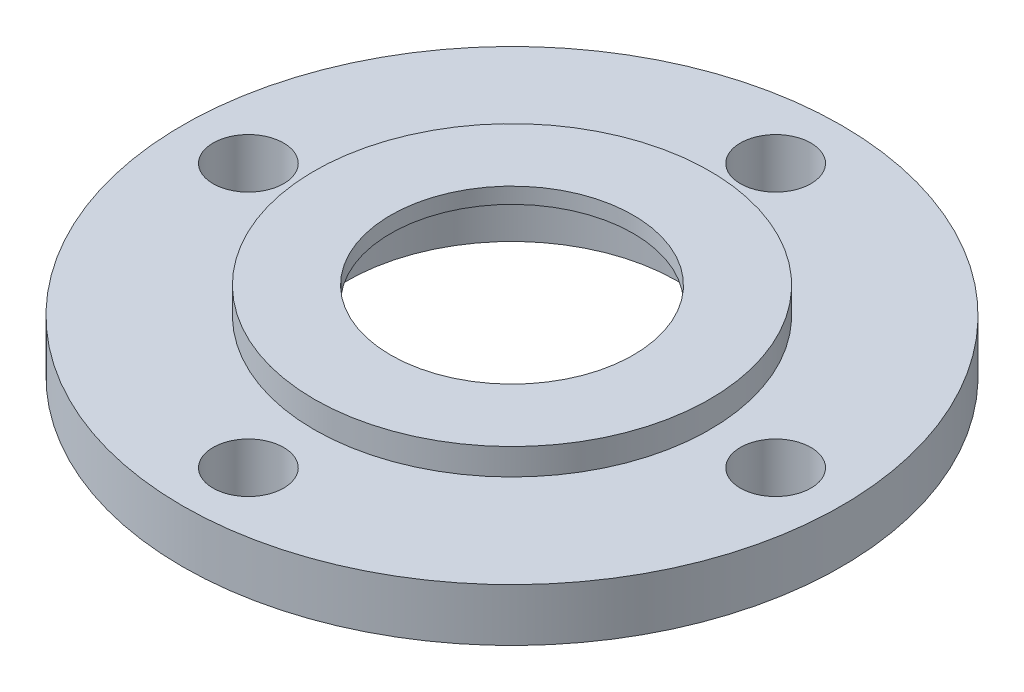
ISO-10303-21;
HEADER;
FILE_DESCRIPTION(('STEP AP214'),'2;1');
FILE_NAME('part.step','',(''),(''),'','','');
FILE_SCHEMA(('AUTOMOTIVE_DESIGN { 1 0 10303 214 1 1 1 1 }'));
ENDSEC;
DATA;
#1=APPLICATION_CONTEXT('core data for automotive mechanical design processes');
#2=APPLICATION_PROTOCOL_DEFINITION('international standard','automotive_design',2000,#1);
#3=PRODUCT_CONTEXT('',#1,'mechanical');
#4=PRODUCT('Part','Part','',(#3));
#5=PRODUCT_RELATED_PRODUCT_CATEGORY('part','',(#4));
#6=PRODUCT_DEFINITION_FORMATION('','',#4);
#7=PRODUCT_DEFINITION_CONTEXT('part definition',#1,'design');
#8=PRODUCT_DEFINITION('design','',#6,#7);
#9=PRODUCT_DEFINITION_SHAPE('','',#8);
#10=(LENGTH_UNIT() NAMED_UNIT(*) SI_UNIT(.MILLI.,.METRE.));
#11=(NAMED_UNIT(*) PLANE_ANGLE_UNIT() SI_UNIT($,.RADIAN.));
#12=(NAMED_UNIT(*) SI_UNIT($,.STERADIAN.) SOLID_ANGLE_UNIT());
#13=UNCERTAINTY_MEASURE_WITH_UNIT(LENGTH_MEASURE(1.E-05),#10,'distance_accuracy_value','');
#14=(GEOMETRIC_REPRESENTATION_CONTEXT(3) GLOBAL_UNCERTAINTY_ASSIGNED_CONTEXT((#13)) GLOBAL_UNIT_ASSIGNED_CONTEXT((#10,
#11,#12)) REPRESENTATION_CONTEXT('',''));
#15=CARTESIAN_POINT('',(0.,0.,0.));
#16=DIRECTION('',(0.,0.,1.));
#17=DIRECTION('',(1.,0.,0.));
#18=AXIS2_PLACEMENT_3D('',#15,#16,#17);
#19=CARTESIAN_POINT('',(0.,2.54,0.));
#20=DIRECTION('',(0.,-1.,0.));
#21=DIRECTION('',(0.,0.,-1.));
#22=AXIS2_PLACEMENT_3D('',#19,#20,#21);
#23=CYLINDRICAL_SURFACE('',#22,15.875);
#24=CARTESIAN_POINT('',(0.,2.54,0.));
#25=DIRECTION('',(0.,1.,0.));
#26=DIRECTION('',(0.,0.,1.));
#27=AXIS2_PLACEMENT_3D('',#24,#25,#26);
#28=CIRCLE('',#27,15.875);
#29=CARTESIAN_POINT('',(0.,2.54,15.875));
#30=VERTEX_POINT('',#29);
#31=EDGE_CURVE('E49',#30,#30,#28,.T.);
#32=ORIENTED_EDGE('',*,*,#31,.F.);
#33=EDGE_LOOP('',(#32));
#34=FACE_BOUND('',#33,.T.);
#35=CARTESIAN_POINT('',(0.,0.,0.));
#36=DIRECTION('',(0.,1.,0.));
#37=DIRECTION('',(0.,0.,1.));
#38=AXIS2_PLACEMENT_3D('',#35,#36,#37);
#39=CIRCLE('',#38,15.875);
#40=CARTESIAN_POINT('',(0.,0.,15.875));
#41=VERTEX_POINT('',#40);
#42=EDGE_CURVE('E44',#41,#41,#39,.T.);
#43=ORIENTED_EDGE('',*,*,#42,.T.);
#44=EDGE_LOOP('',(#43));
#45=FACE_BOUND('',#44,.T.);
#46=ADVANCED_FACE('F41',(#34,#45),#23,.T.);
#47=CARTESIAN_POINT('',(0.,2.54,0.));
#48=DIRECTION('',(0.,1.,0.));
#49=DIRECTION('',(0.,0.,1.));
#50=AXIS2_PLACEMENT_3D('',#47,#48,#49);
#51=PLANE('',#50);
#52=CARTESIAN_POINT('',(0.,2.54,-12.7));
#53=DIRECTION('',(0.,1.,0.));
#54=DIRECTION('',(0.,0.,1.));
#55=AXIS2_PLACEMENT_3D('',#52,#53,#54);
#56=CIRCLE('',#55,1.7);
#57=CARTESIAN_POINT('',(0.,2.54,-11.));
#58=VERTEX_POINT('',#57);
#59=EDGE_CURVE('E98',#58,#58,#56,.T.);
#60=ORIENTED_EDGE('',*,*,#59,.F.);
#61=EDGE_LOOP('',(#60));
#62=FACE_BOUND('',#61,.T.);
#63=CARTESIAN_POINT('',(12.7,2.54,0.));
#64=DIRECTION('',(0.,1.,0.));
#65=DIRECTION('',(0.,0.,1.));
#66=AXIS2_PLACEMENT_3D('',#63,#64,#65);
#67=CIRCLE('',#66,1.70000000000004);
#68=CARTESIAN_POINT('',(12.7,2.54,1.70000000000004));
#69=VERTEX_POINT('',#68);
#70=EDGE_CURVE('E94',#69,#69,#67,.T.);
#71=ORIENTED_EDGE('',*,*,#70,.F.);
#72=EDGE_LOOP('',(#71));
#73=FACE_BOUND('',#72,.T.);
#74=CARTESIAN_POINT('',(0.,2.54,12.7));
#75=DIRECTION('',(0.,1.,0.));
#76=DIRECTION('',(0.,0.,1.));
#77=AXIS2_PLACEMENT_3D('',#74,#75,#76);
#78=CIRCLE('',#77,1.7);
#79=CARTESIAN_POINT('',(0.,2.54,14.4));
#80=VERTEX_POINT('',#79);
#81=EDGE_CURVE('E86',#80,#80,#78,.T.);
#82=ORIENTED_EDGE('',*,*,#81,.F.);
#83=EDGE_LOOP('',(#82));
#84=FACE_BOUND('',#83,.T.);
#85=CARTESIAN_POINT('',(-12.7,2.54,0.));
#86=DIRECTION('',(0.,1.,0.));
#87=DIRECTION('',(0.,0.,1.));
#88=AXIS2_PLACEMENT_3D('',#85,#86,#87);
#89=CIRCLE('',#88,1.7);
#90=CARTESIAN_POINT('',(-12.7,2.54,1.7));
#91=VERTEX_POINT('',#90);
#92=EDGE_CURVE('E77',#91,#91,#89,.T.);
#93=ORIENTED_EDGE('',*,*,#92,.F.);
#94=EDGE_LOOP('',(#93));
#95=FACE_BOUND('',#94,.T.);
#96=CARTESIAN_POINT('',(0.,2.54,0.));
#97=DIRECTION('',(0.,1.,0.));
#98=DIRECTION('',(0.,0.,1.));
#99=AXIS2_PLACEMENT_3D('',#96,#97,#98);
#100=CIRCLE('',#99,9.525);
#101=CARTESIAN_POINT('',(0.,2.54,9.525));
#102=VERTEX_POINT('',#101);
#103=EDGE_CURVE('E10',#102,#102,#100,.T.);
#104=ORIENTED_EDGE('',*,*,#103,.F.);
#105=EDGE_LOOP('',(#104));
#106=FACE_BOUND('',#105,.T.);
#107=ORIENTED_EDGE('',*,*,#31,.T.);
#108=EDGE_LOOP('',(#107));
#109=FACE_BOUND('',#108,.T.);
#110=ADVANCED_FACE('F112',(#62,#73,#84,#95,#106,#109),#51,.T.);
#111=CARTESIAN_POINT('',(0.,0.,0.));
#112=DIRECTION('',(0.,1.,0.));
#113=DIRECTION('',(0.,0.,1.));
#114=AXIS2_PLACEMENT_3D('',#111,#112,#113);
#115=PLANE('',#114);
#116=CARTESIAN_POINT('',(0.,0.,-12.7));
#117=DIRECTION('',(0.,1.,0.));
#118=DIRECTION('',(0.,0.,1.));
#119=AXIS2_PLACEMENT_3D('',#116,#117,#118);
#120=CIRCLE('',#119,1.7);
#121=CARTESIAN_POINT('',(0.,0.,-11.));
#122=VERTEX_POINT('',#121);
#123=EDGE_CURVE('E73',#122,#122,#120,.F.);
#124=ORIENTED_EDGE('',*,*,#123,.F.);
#125=EDGE_LOOP('',(#124));
#126=FACE_BOUND('',#125,.T.);
#127=CARTESIAN_POINT('',(12.7,0.,0.));
#128=DIRECTION('',(0.,1.,0.));
#129=DIRECTION('',(0.,0.,1.));
#130=AXIS2_PLACEMENT_3D('',#127,#128,#129);
#131=CIRCLE('',#130,1.70000000000004);
#132=CARTESIAN_POINT('',(12.7,0.,1.70000000000004));
#133=VERTEX_POINT('',#132);
#134=EDGE_CURVE('E90',#133,#133,#131,.F.);
#135=ORIENTED_EDGE('',*,*,#134,.F.);
#136=EDGE_LOOP('',(#135));
#137=FACE_BOUND('',#136,.T.);
#138=CARTESIAN_POINT('',(0.,0.,12.7));
#139=DIRECTION('',(0.,1.,0.));
#140=DIRECTION('',(0.,0.,1.));
#141=AXIS2_PLACEMENT_3D('',#138,#139,#140);
#142=CIRCLE('',#141,1.7);
#143=CARTESIAN_POINT('',(0.,0.,14.4));
#144=VERTEX_POINT('',#143);
#145=EDGE_CURVE('E81',#144,#144,#142,.F.);
#146=ORIENTED_EDGE('',*,*,#145,.F.);
#147=EDGE_LOOP('',(#146));
#148=FACE_BOUND('',#147,.T.);
#149=CARTESIAN_POINT('',(-12.7,0.,0.));
#150=DIRECTION('',(0.,1.,0.));
#151=DIRECTION('',(0.,0.,1.));
#152=AXIS2_PLACEMENT_3D('',#149,#150,#151);
#153=CIRCLE('',#152,1.7);
#154=CARTESIAN_POINT('',(-12.7,0.,1.7));
#155=VERTEX_POINT('',#154);
#156=EDGE_CURVE('E82',#155,#155,#153,.F.);
#157=ORIENTED_EDGE('',*,*,#156,.F.);
#158=EDGE_LOOP('',(#157));
#159=FACE_BOUND('',#158,.T.);
#160=CARTESIAN_POINT('',(0.,0.,0.));
#161=DIRECTION('',(0.,-1.,0.));
#162=DIRECTION('',(0.,0.,-1.));
#163=AXIS2_PLACEMENT_3D('',#160,#161,#162);
#164=CIRCLE('',#163,7.9629);
#165=CARTESIAN_POINT('',(0.,0.,-7.9629));
#166=VERTEX_POINT('',#165);
#167=EDGE_CURVE('E61',#166,#166,#164,.T.);
#168=ORIENTED_EDGE('',*,*,#167,.F.);
#169=EDGE_LOOP('',(#168));
#170=FACE_BOUND('',#169,.T.);
#171=ORIENTED_EDGE('',*,*,#42,.F.);
#172=EDGE_LOOP('',(#171));
#173=FACE_BOUND('',#172,.T.);
#174=ADVANCED_FACE('F115',(#126,#137,#148,#159,#170,#173),#115,.F.);
#175=CARTESIAN_POINT('',(0.,3.81,0.));
#176=DIRECTION('',(0.,-1.,0.));
#177=DIRECTION('',(0.,0.,-1.));
#178=AXIS2_PLACEMENT_3D('',#175,#176,#177);
#179=CYLINDRICAL_SURFACE('',#178,9.525);
#180=CARTESIAN_POINT('',(0.,3.81,0.));
#181=DIRECTION('',(0.,1.,0.));
#182=DIRECTION('',(0.,0.,1.));
#183=AXIS2_PLACEMENT_3D('',#180,#181,#182);
#184=CIRCLE('',#183,9.525);
#185=CARTESIAN_POINT('',(0.,3.81,9.525));
#186=VERTEX_POINT('',#185);
#187=EDGE_CURVE('E56',#186,#186,#184,.T.);
#188=ORIENTED_EDGE('',*,*,#187,.F.);
#189=EDGE_LOOP('',(#188));
#190=FACE_BOUND('',#189,.T.);
#191=ORIENTED_EDGE('',*,*,#103,.T.);
#192=EDGE_LOOP('',(#191));
#193=FACE_BOUND('',#192,.T.);
#194=ADVANCED_FACE('F133',(#190,#193),#179,.T.);
#195=CARTESIAN_POINT('',(0.,3.81,0.));
#196=DIRECTION('',(0.,1.,0.));
#197=DIRECTION('',(0.,0.,1.));
#198=AXIS2_PLACEMENT_3D('',#195,#196,#197);
#199=PLANE('',#198);
#200=CARTESIAN_POINT('',(0.,3.81,0.));
#201=DIRECTION('',(0.,1.,0.));
#202=DIRECTION('',(0.,0.,1.));
#203=AXIS2_PLACEMENT_3D('',#200,#201,#202);
#204=CIRCLE('',#203,5.842);
#205=CARTESIAN_POINT('',(0.,3.81,5.842));
#206=VERTEX_POINT('',#205);
#207=EDGE_CURVE('E65',#206,#206,#204,.T.);
#208=ORIENTED_EDGE('',*,*,#207,.F.);
#209=EDGE_LOOP('',(#208));
#210=FACE_BOUND('',#209,.T.);
#211=ORIENTED_EDGE('',*,*,#187,.T.);
#212=EDGE_LOOP('',(#211));
#213=FACE_BOUND('',#212,.T.);
#214=ADVANCED_FACE('F138',(#210,#213),#199,.T.);
#215=CARTESIAN_POINT('',(0.,3.048,0.));
#216=DIRECTION('',(0.,-1.,0.));
#217=DIRECTION('',(0.,0.,-1.));
#218=AXIS2_PLACEMENT_3D('',#215,#216,#217);
#219=CYLINDRICAL_SURFACE('',#218,7.9629);
#220=CARTESIAN_POINT('',(0.,3.048,0.));
#221=DIRECTION('',(0.,-1.,0.));
#222=DIRECTION('',(0.,0.,-1.));
#223=AXIS2_PLACEMENT_3D('',#220,#221,#222);
#224=CIRCLE('',#223,7.9629);
#225=CARTESIAN_POINT('',(0.,3.048,-7.9629));
#226=VERTEX_POINT('',#225);
#227=EDGE_CURVE('E60',#226,#226,#224,.T.);
#228=CARTESIAN_POINT('',(0.,3.048,-7.9629));
#229=CARTESIAN_POINT('',(0.,3.01625,-7.9629));
#230=CARTESIAN_POINT('',(0.,2.9845,-7.9629));
#231=CARTESIAN_POINT('',(0.,2.921,-7.9629));
#232=CARTESIAN_POINT('',(0.,2.88925,-7.9629));
#233=CARTESIAN_POINT('',(0.,2.82575,-7.9629));
#234=CARTESIAN_POINT('',(0.,2.794,-7.9629));
#235=CARTESIAN_POINT('',(0.,2.7305,-7.9629));
#236=CARTESIAN_POINT('',(0.,2.69875,-7.9629));
#237=CARTESIAN_POINT('',(0.,2.63525,-7.9629));
#238=CARTESIAN_POINT('',(0.,2.6035,-7.9629));
#239=CARTESIAN_POINT('',(0.,2.54,-7.9629));
#240=CARTESIAN_POINT('',(0.,2.50825,-7.9629));
#241=CARTESIAN_POINT('',(0.,2.44475,-7.9629));
#242=CARTESIAN_POINT('',(0.,2.413,-7.9629));
#243=CARTESIAN_POINT('',(0.,2.3495,-7.9629));
#244=CARTESIAN_POINT('',(0.,2.31775,-7.9629));
#245=CARTESIAN_POINT('',(0.,2.25425,-7.9629));
#246=CARTESIAN_POINT('',(0.,2.2225,-7.9629));
#247=CARTESIAN_POINT('',(0.,2.159,-7.9629));
#248=CARTESIAN_POINT('',(0.,2.12725,-7.9629));
#249=CARTESIAN_POINT('',(0.,2.06375,-7.9629));
#250=CARTESIAN_POINT('',(0.,2.032,-7.9629));
#251=CARTESIAN_POINT('',(0.,1.9685,-7.9629));
#252=CARTESIAN_POINT('',(0.,1.93675,-7.9629));
#253=CARTESIAN_POINT('',(0.,1.87325,-7.9629));
#254=CARTESIAN_POINT('',(0.,1.8415,-7.9629));
#255=CARTESIAN_POINT('',(0.,1.778,-7.9629));
#256=CARTESIAN_POINT('',(0.,1.74625,-7.9629));
#257=CARTESIAN_POINT('',(0.,1.68275,-7.9629));
#258=CARTESIAN_POINT('',(0.,1.651,-7.9629));
#259=CARTESIAN_POINT('',(0.,1.5875,-7.9629));
#260=CARTESIAN_POINT('',(0.,1.55575,-7.9629));
#261=CARTESIAN_POINT('',(0.,1.49225,-7.9629));
#262=CARTESIAN_POINT('',(0.,1.4605,-7.9629));
#263=CARTESIAN_POINT('',(0.,1.397,-7.9629));
#264=CARTESIAN_POINT('',(0.,1.36525,-7.9629));
#265=CARTESIAN_POINT('',(0.,1.30175,-7.9629));
#266=CARTESIAN_POINT('',(0.,1.27,-7.9629));
#267=CARTESIAN_POINT('',(0.,1.2065,-7.9629));
#268=CARTESIAN_POINT('',(0.,1.17475,-7.9629));
#269=CARTESIAN_POINT('',(0.,1.11125,-7.9629));
#270=CARTESIAN_POINT('',(0.,1.0795,-7.9629));
#271=CARTESIAN_POINT('',(0.,1.016,-7.9629));
#272=CARTESIAN_POINT('',(0.,0.98425,-7.9629));
#273=CARTESIAN_POINT('',(0.,0.92075,-7.9629));
#274=CARTESIAN_POINT('',(0.,0.889,-7.9629));
#275=CARTESIAN_POINT('',(0.,0.8255,-7.9629));
#276=CARTESIAN_POINT('',(0.,0.79375,-7.9629));
#277=CARTESIAN_POINT('',(0.,0.73025,-7.9629));
#278=CARTESIAN_POINT('',(0.,0.6985,-7.9629));
#279=CARTESIAN_POINT('',(0.,0.635,-7.9629));
#280=CARTESIAN_POINT('',(0.,0.60325,-7.9629));
#281=CARTESIAN_POINT('',(0.,0.53975,-7.9629));
#282=CARTESIAN_POINT('',(0.,0.508,-7.9629));
#283=CARTESIAN_POINT('',(0.,0.4445,-7.9629));
#284=CARTESIAN_POINT('',(0.,0.41275,-7.9629));
#285=CARTESIAN_POINT('',(0.,0.34925,-7.9629));
#286=CARTESIAN_POINT('',(0.,0.3175,-7.9629));
#287=CARTESIAN_POINT('',(0.,0.254,-7.9629));
#288=CARTESIAN_POINT('',(0.,0.22225,-7.9629));
#289=CARTESIAN_POINT('',(0.,0.15875,-7.9629));
#290=CARTESIAN_POINT('',(0.,0.127,-7.9629));
#291=CARTESIAN_POINT('',(0.,0.0634999999999999,-7.9629));
#292=CARTESIAN_POINT('',(0.,0.03175,-7.9629));
#293=CARTESIAN_POINT('',(0.,0.,-7.9629));
#294=B_SPLINE_CURVE_WITH_KNOTS('',3,(#228,#229,#230,#231,#232,#233,#234,#235,#236,#237,#238,
#239,#240,#241,#242,#243,#244,#245,#246,#247,#248,#249,#250,#251,#252,#253,#254,#255,#256,#257,
#258,#259,#260,#261,#262,#263,#264,#265,#266,#267,#268,#269,#270,#271,#272,#273,#274,#275,#276,
#277,#278,#279,#280,#281,#282,#283,#284,#285,#286,#287,#288,#289,#290,#291,#292,#293),
.UNSPECIFIED.,.F.,.F.,(4,2,2,2,2,2,2,2,2,2,2,2,2,2,2,2,2,2,2,2,2,2,2,2,2,2,2,2,2,2,2,2,4),(0.,
0.0952499999999998,0.1905,0.28575,0.381,0.47625,0.5715,0.66675,0.762,0.85725,0.9525,1.04775,
1.143,1.23825,1.3335,1.42875,1.524,1.61925,1.7145,1.80975,1.905,2.00025,2.0955,2.19075,2.286,
2.38125,2.4765,2.57175,2.667,2.76225,2.8575,2.95275,3.048),.UNSPECIFIED.);
#295=EDGE_CURVE('BSEAM146',#226,#166,#294,.T.);
#296=ORIENTED_EDGE('',*,*,#227,.F.);
#297=ORIENTED_EDGE('',*,*,#167,.T.);
#298=ORIENTED_EDGE('',*,*,#295,.T.);
#299=ORIENTED_EDGE('',*,*,#295,.F.);
#300=EDGE_LOOP('',(#296,#298,#297,#299));
#301=FACE_BOUND('',#300,.T.);
#302=ADVANCED_FACE('F146',(#301),#219,.F.);
#303=CARTESIAN_POINT('',(0.,3.048,0.));
#304=DIRECTION('',(0.,-1.,0.));
#305=DIRECTION('',(0.,0.,-1.));
#306=AXIS2_PLACEMENT_3D('',#303,#304,#305);
#307=PLANE('',#306);
#308=CARTESIAN_POINT('',(0.,3.048,0.));
#309=DIRECTION('',(0.,-1.,0.));
#310=DIRECTION('',(0.,0.,-1.));
#311=AXIS2_PLACEMENT_3D('',#308,#309,#310);
#312=CIRCLE('',#311,5.842);
#313=CARTESIAN_POINT('',(0.,3.048,-5.842));
#314=VERTEX_POINT('',#313);
#315=EDGE_CURVE('E69',#314,#314,#312,.F.);
#316=ORIENTED_EDGE('',*,*,#315,.T.);
#317=EDGE_LOOP('',(#316));
#318=FACE_BOUND('',#317,.T.);
#319=ORIENTED_EDGE('',*,*,#227,.T.);
#320=EDGE_LOOP('',(#319));
#321=FACE_BOUND('',#320,.T.);
#322=ADVANCED_FACE('F150',(#318,#321),#307,.T.);
#323=CARTESIAN_POINT('',(0.,-0.00100000000000013,0.));
#324=DIRECTION('',(0.,1.,0.));
#325=DIRECTION('',(0.,0.,1.));
#326=AXIS2_PLACEMENT_3D('',#323,#324,#325);
#327=CYLINDRICAL_SURFACE('',#326,5.842);
#328=ORIENTED_EDGE('',*,*,#315,.F.);
#329=EDGE_LOOP('',(#328));
#330=FACE_BOUND('',#329,.T.);
#331=ORIENTED_EDGE('',*,*,#207,.T.);
#332=EDGE_LOOP('',(#331));
#333=FACE_BOUND('',#332,.T.);
#334=ADVANCED_FACE('F154',(#330,#333),#327,.F.);
#335=CARTESIAN_POINT('',(-12.7,-0.00100000000000013,0.));
#336=DIRECTION('',(0.,1.,0.));
#337=DIRECTION('',(0.,0.,1.));
#338=AXIS2_PLACEMENT_3D('',#335,#336,#337);
#339=CYLINDRICAL_SURFACE('',#338,1.7);
#340=ORIENTED_EDGE('',*,*,#92,.T.);
#341=EDGE_LOOP('',(#340));
#342=FACE_BOUND('',#341,.T.);
#343=ORIENTED_EDGE('',*,*,#156,.T.);
#344=EDGE_LOOP('',(#343));
#345=FACE_BOUND('',#344,.T.);
#346=ADVANCED_FACE('F158',(#342,#345),#339,.F.);
#347=CARTESIAN_POINT('',(0.,-0.00100000000000013,12.7));
#348=DIRECTION('',(0.,1.,0.));
#349=DIRECTION('',(0.,0.,1.));
#350=AXIS2_PLACEMENT_3D('',#347,#348,#349);
#351=CYLINDRICAL_SURFACE('',#350,1.7);
#352=ORIENTED_EDGE('',*,*,#81,.T.);
#353=EDGE_LOOP('',(#352));
#354=FACE_BOUND('',#353,.T.);
#355=ORIENTED_EDGE('',*,*,#145,.T.);
#356=EDGE_LOOP('',(#355));
#357=FACE_BOUND('',#356,.T.);
#358=ADVANCED_FACE('F162',(#354,#357),#351,.F.);
#359=CARTESIAN_POINT('',(12.7,-0.00100000000000013,0.));
#360=DIRECTION('',(0.,1.,0.));
#361=DIRECTION('',(0.,0.,1.));
#362=AXIS2_PLACEMENT_3D('',#359,#360,#361);
#363=CYLINDRICAL_SURFACE('',#362,1.70000000000004);
#364=ORIENTED_EDGE('',*,*,#70,.T.);
#365=EDGE_LOOP('',(#364));
#366=FACE_BOUND('',#365,.T.);
#367=ORIENTED_EDGE('',*,*,#134,.T.);
#368=EDGE_LOOP('',(#367));
#369=FACE_BOUND('',#368,.T.);
#370=ADVANCED_FACE('F166',(#366,#369),#363,.F.);
#371=CARTESIAN_POINT('',(0.,-0.00100000000000013,-12.7));
#372=DIRECTION('',(0.,1.,0.));
#373=DIRECTION('',(0.,0.,1.));
#374=AXIS2_PLACEMENT_3D('',#371,#372,#373);
#375=CYLINDRICAL_SURFACE('',#374,1.7);
#376=ORIENTED_EDGE('',*,*,#59,.T.);
#377=EDGE_LOOP('',(#376));
#378=FACE_BOUND('',#377,.T.);
#379=ORIENTED_EDGE('',*,*,#123,.T.);
#380=EDGE_LOOP('',(#379));
#381=FACE_BOUND('',#380,.T.);
#382=ADVANCED_FACE('F109',(#378,#381),#375,.F.);
#383=CLOSED_SHELL('',(#46,#110,#174,#194,#214,#302,#322,#334,#346,#358,#370,#382));
#384=MANIFOLD_SOLID_BREP('B2',#383);
#385=ADVANCED_BREP_SHAPE_REPRESENTATION('',(#18,#384),#14);
#386=SHAPE_DEFINITION_REPRESENTATION(#9,#385);
ENDSEC;
END-ISO-10303-21;
